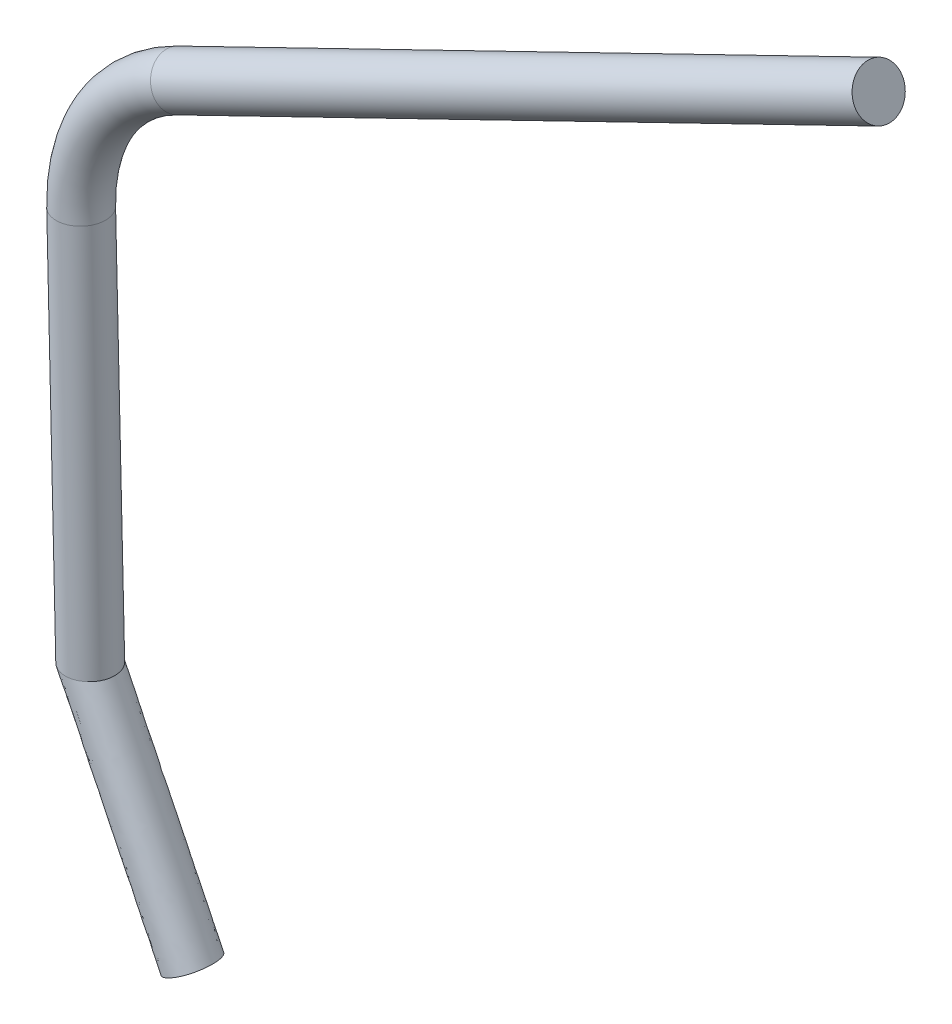
ISO-10303-21;
HEADER;
FILE_DESCRIPTION(('STEP AP214'),'2;1');
FILE_NAME('part.step','',(''),(''),'','','');
FILE_SCHEMA(('AUTOMOTIVE_DESIGN { 1 0 10303 214 1 1 1 1 }'));
ENDSEC;
DATA;
#1=APPLICATION_CONTEXT('core data for automotive mechanical design processes');
#2=APPLICATION_PROTOCOL_DEFINITION('international standard','automotive_design',2000,#1);
#3=PRODUCT_CONTEXT('',#1,'mechanical');
#4=PRODUCT('Part','Part','',(#3));
#5=PRODUCT_RELATED_PRODUCT_CATEGORY('part','',(#4));
#6=PRODUCT_DEFINITION_FORMATION('','',#4);
#7=PRODUCT_DEFINITION_CONTEXT('part definition',#1,'design');
#8=PRODUCT_DEFINITION('design','',#6,#7);
#9=PRODUCT_DEFINITION_SHAPE('','',#8);
#10=(LENGTH_UNIT() NAMED_UNIT(*) SI_UNIT(.MILLI.,.METRE.));
#11=(NAMED_UNIT(*) PLANE_ANGLE_UNIT() SI_UNIT($,.RADIAN.));
#12=(NAMED_UNIT(*) SI_UNIT($,.STERADIAN.) SOLID_ANGLE_UNIT());
#13=UNCERTAINTY_MEASURE_WITH_UNIT(LENGTH_MEASURE(1.E-05),#10,'distance_accuracy_value','');
#14=(GEOMETRIC_REPRESENTATION_CONTEXT(3) GLOBAL_UNCERTAINTY_ASSIGNED_CONTEXT((#13)) GLOBAL_UNIT_ASSIGNED_CONTEXT((#10,
#11,#12)) REPRESENTATION_CONTEXT('',''));
#15=CARTESIAN_POINT('',(0.,0.,0.));
#16=DIRECTION('',(0.,0.,1.));
#17=DIRECTION('',(1.,0.,0.));
#18=AXIS2_PLACEMENT_3D('',#15,#16,#17);
#19=CARTESIAN_POINT('',(0.,0.,0.));
#20=DIRECTION('',(0.,0.,-1.));
#21=DIRECTION('',(-1.,0.,0.));
#22=AXIS2_PLACEMENT_3D('',#19,#20,#21);
#23=TOROIDAL_SURFACE('',#22,88.8758294599473,12.7);
#24=CARTESIAN_POINT('',(-38.8641021219348,79.9280590809602,0.));
#25=DIRECTION('',(0.899322791884384,0.437285394219013,0.));
#26=DIRECTION('',(0.,0.,1.));
#27=AXIS2_PLACEMENT_3D('',#24,#25,#26);
#28=CIRCLE('',#27,12.7);
#29=CARTESIAN_POINT('',(-38.8641021219348,79.9280590809602,12.7));
#30=VERTEX_POINT('',#29);
#31=EDGE_CURVE('E86',#30,#30,#28,.T.);
#32=ORIENTED_EDGE('',*,*,#31,.F.);
#33=EDGE_LOOP('',(#32));
#34=FACE_BOUND('',#33,.T.);
#35=CARTESIAN_POINT('',(-88.851665491492,-2.07234205227966,0.));
#36=DIRECTION('',(0.0233172738288038,-0.999728115409981,0.));
#37=DIRECTION('',(0.999728115409981,0.0233172738288038,0.));
#38=AXIS2_PLACEMENT_3D('',#35,#36,#37);
#39=CIRCLE('',#38,12.7);
#40=CARTESIAN_POINT('',(-76.1551184257853,-1.77621267465385,0.));
#41=VERTEX_POINT('',#40);
#42=EDGE_CURVE('E82',#41,#41,#39,.T.);
#43=ORIENTED_EDGE('',*,*,#42,.F.);
#44=EDGE_LOOP('',(#43));
#45=FACE_BOUND('',#44,.T.);
#46=CARTESIAN_POINT('',(-68.2785297565327,37.4552974767412,-6.34980000000002));
#47=CARTESIAN_POINT('',(-68.3611876244129,37.382223809573,-6.41445774121699));
#48=CARTESIAN_POINT('',(-68.4443483690339,37.3107161993584,-6.48021370807255));
#49=CARTESIAN_POINT('',(-68.6117186874237,37.1706861630903,-6.61351606039512));
#50=CARTESIAN_POINT('',(-68.6959281257715,37.1021633566365,-6.68106221593499));
#51=CARTESIAN_POINT('',(-68.9501459405805,36.9008877669146,-6.88573794059409));
#52=CARTESIAN_POINT('',(-69.1218217285547,36.7723591420587,-7.02496654285916));
#53=CARTESIAN_POINT('',(-69.4701443978759,36.5256206836409,-7.3067283433511));
#54=CARTESIAN_POINT('',(-69.6467961121818,36.4074213740786,-7.44926472887694));
#55=CARTESIAN_POINT('',(-70.0052925566176,36.1809426296689,-7.73573144752601));
#56=CARTESIAN_POINT('',(-70.1871379358452,36.0726644419297,-7.87966195338593));
#57=CARTESIAN_POINT('',(-70.5585429060159,35.8645314563947,-8.1691977338584));
#58=CARTESIAN_POINT('',(-70.7481691642829,35.7647942659621,-8.31480222789594));
#59=CARTESIAN_POINT('',(-71.1332560641007,35.5752027925097,-8.60466404939599));
#60=CARTESIAN_POINT('',(-71.3287166128607,35.4853483524172,-8.74892139823618));
#61=CARTESIAN_POINT('',(-71.9239698668014,35.2308656546435,-9.17782825917873));
#62=CARTESIAN_POINT('',(-72.3329777738266,35.0811247184879,-9.45888538305785));
#63=CARTESIAN_POINT('',(-73.0324228439706,34.8680810695907,-9.91028270319883));
#64=CARTESIAN_POINT('',(-73.3159211557014,34.7926966771,-10.0857907650338));
#65=CARTESIAN_POINT('',(-73.8935620655111,34.6618652041449,-10.4265341688002));
#66=CARTESIAN_POINT('',(-74.1877037793146,34.6064164715521,-10.5917703610534));
#67=CARTESIAN_POINT('',(-74.7847851582528,34.5171980425895,-10.9087875560176));
#68=CARTESIAN_POINT('',(-75.0876828684849,34.4833386210953,-11.0606219573564));
#69=CARTESIAN_POINT('',(-75.7023587330905,34.438654632966,-11.3489918503462));
#70=CARTESIAN_POINT('',(-76.0141350381799,34.4278253045428,-11.4855304990722));
#71=CARTESIAN_POINT('',(-76.5817506444538,34.430627926228,-11.7150845210898));
#72=CARTESIAN_POINT('',(-76.8363046895836,34.4398003241575,-11.8113427446681));
#73=CARTESIAN_POINT('',(-77.3487813644931,34.4748280943983,-11.9909438221812));
#74=CARTESIAN_POINT('',(-77.6067032357763,34.5006797716239,-12.0742895316516));
#75=CARTESIAN_POINT('',(-78.1244953314751,34.5697693032544,-12.2267574836909));
#76=CARTESIAN_POINT('',(-78.3843658889851,34.6130101997432,-12.2958772343589));
#77=CARTESIAN_POINT('',(-78.9042044750144,34.7173562301637,-12.4186635047221));
#78=CARTESIAN_POINT('',(-79.164172504587,34.7784615630576,-12.4723298522942));
#79=CARTESIAN_POINT('',(-79.6836238758807,34.9191131531688,-12.5634681680949));
#80=CARTESIAN_POINT('',(-79.9430958641223,34.9987632789432,-12.6008453831023));
#81=CARTESIAN_POINT('',(-80.4577735483932,35.1761111705754,-12.6582402521289));
#82=CARTESIAN_POINT('',(-80.7129792295023,35.2738089995356,-12.6782578454502));
#83=CARTESIAN_POINT('',(-81.2167504163944,35.4866221386738,-12.7005883706939));
#84=CARTESIAN_POINT('',(-81.4653174626995,35.6017333659499,-12.7029054462975));
#85=CARTESIAN_POINT('',(-81.9536589867046,35.8483999288208,-12.6899026260559));
#86=CARTESIAN_POINT('',(-82.1934339981349,35.9799542640736,-12.674583802653));
#87=CARTESIAN_POINT('',(-82.6401833207013,36.2451086232329,-12.6290097663058));
#88=CARTESIAN_POINT('',(-82.8481227554667,36.3773550509284,-12.6002931907044));
#89=CARTESIAN_POINT('',(-83.2540210427322,36.6531805061838,-12.5293102489984));
#90=CARTESIAN_POINT('',(-83.4519765719696,36.7967632669088,-12.4870394051943));
#91=CARTESIAN_POINT('',(-83.8368162873283,37.0939718711076,-12.3896983544277));
#92=CARTESIAN_POINT('',(-84.0237023242137,37.247596026624,-12.3346302947192));
#93=CARTESIAN_POINT('',(-84.3857438442941,37.5636753106242,-12.2125448028781));
#94=CARTESIAN_POINT('',(-84.5608978446694,37.7261315507176,-12.1455258641717));
#95=CARTESIAN_POINT('',(-84.9094172216193,38.0689080681905,-11.9959827061691));
#96=CARTESIAN_POINT('',(-85.0820058672186,38.2497121426851,-11.9127570744036));
#97=CARTESIAN_POINT('',(-85.413073052434,38.6184571973195,-11.7350304796194));
#98=CARTESIAN_POINT('',(-85.5715513443383,38.8063983026695,-11.6405293187233));
#99=CARTESIAN_POINT('',(-86.0257883918963,39.379188181734,-11.3416725112759));
#100=CARTESIAN_POINT('',(-86.3004127360984,39.7730666837944,-11.1219356078071));
#101=CARTESIAN_POINT('',(-86.7339424539597,40.4779757021258,-10.7073632035783));
#102=CARTESIAN_POINT('',(-86.9047620413378,40.7859466821459,-10.5194016953883));
#103=CARTESIAN_POINT('',(-87.2156593836741,41.4074890645984,-10.1278497309483));
#104=CARTESIAN_POINT('',(-87.3557342266351,41.7210609944874,-9.92425779672097));
#105=CARTESIAN_POINT('',(-87.6066785134096,42.3521192934771,-9.50361344359423));
#106=CARTESIAN_POINT('',(-87.7174663088841,42.6696140759,-9.28652543517269));
#107=CARTESIAN_POINT('',(-87.9106671042042,43.3056694140145,-8.84176561701304));
#108=CARTESIAN_POINT('',(-87.9930869296525,43.6242296946849,-8.61409636820656));
#109=CARTESIAN_POINT('',(-88.1104486946373,44.1665898935884,-8.21892903824646));
#110=CARTESIAN_POINT('',(-88.1522226049346,44.390514592692,-8.05357834271191));
#111=CARTESIAN_POINT('',(-88.2227713179023,44.8377125614741,-7.71930250161433));
#112=CARTESIAN_POINT('',(-88.2515474879727,45.0609858972214,-7.55037773401234));
#113=CARTESIAN_POINT('',(-88.2963207323762,45.5049747333173,-7.21077024634431));
#114=CARTESIAN_POINT('',(-88.3124057723668,45.7256972016901,-7.04010808328857));
#115=CARTESIAN_POINT('',(-88.3324302096193,46.1659016286884,-6.69650767073097));
#116=CARTESIAN_POINT('',(-88.336370292617,46.3853836566539,-6.52356955028935));
#117=CARTESIAN_POINT('',(-88.3343889833309,46.6041306373585,-6.3498));
#118=B_SPLINE_CURVE_WITH_KNOTS('',3,(#46,#47,#48,#49,#50,#51,#52,#53,#54,#55,#56,#57,#58,#59,
#60,#61,#62,#63,#64,#65,#66,#67,#68,#69,#70,#71,#72,#73,#74,#75,#76,#77,#78,#79,#80,#81,#82,#83,
#84,#85,#86,#87,#88,#89,#90,#91,#92,#93,#94,#95,#96,#97,#98,#99,#100,#101,#102,#103,#104,#105,
#106,#107,#108,#109,#110,#111,#112,#113,#114,#115,#116,#117),.UNSPECIFIED.,.F.,.F.,(4,2,2,2,2,2,
2,2,2,2,2,2,2,2,2,2,2,2,2,2,2,2,2,2,2,2,2,2,2,2,2,2,2,2,2,4),(0.,0.383594238035366,
0.767139444736189,1.53386782138117,2.30136848503539,3.06896549333994,3.84583870061765,
4.6226995587766,6.17498795452379,7.19977481699324,8.22447673270026,9.24489174409625,
10.2650957501453,11.0812351539779,11.8971938143865,12.7132952813926,13.5294058379432,
14.3502022918438,15.1710016156504,15.9916087849127,16.8121660555467,17.5556250440723,
18.2993298903325,19.0429100397987,19.7865839941884,20.5761293110602,21.3656884859214,
22.9445280738512,24.1406792992436,25.3369437695963,26.5365089084683,27.7357852184842,
28.5799057122152,29.423937381327,30.262066146771,31.1001475884131),.UNSPECIFIED.);
#119=CARTESIAN_POINT('',(-68.2787854715161,37.4550714045806,-6.35));
#120=VERTEX_POINT('',#119);
#121=CARTESIAN_POINT('',(-88.3343912742981,46.6038788428488,-6.35));
#122=VERTEX_POINT('',#121);
#123=EDGE_CURVE('E62',#120,#122,#118,.T.);
#124=ORIENTED_EDGE('',*,*,#123,.F.);
#125=CARTESIAN_POINT('',(0.,0.,-6.35));
#126=DIRECTION('',(0.,0.,1.));
#127=DIRECTION('',(1.,0.,0.));
#128=AXIS2_PLACEMENT_3D('',#125,#126,#127);
#129=CIRCLE('',#128,77.8773068318849);
#130=CARTESIAN_POINT('',(-64.5741252389737,43.5322555010522,-6.34999999999993));
#131=VERTEX_POINT('',#130);
#132=EDGE_CURVE('E72',#120,#131,#129,.F.);
#133=ORIENTED_EDGE('',*,*,#132,.T.);
#134=CARTESIAN_POINT('',(-81.8947582558495,57.1678042235169,-6.34980000000003));
#135=CARTESIAN_POINT('',(-81.7182928434288,57.2607907419098,-6.50824253962551));
#136=CARTESIAN_POINT('',(-81.5390322799268,57.3496764295566,-6.66599417179145));
#137=CARTESIAN_POINT('',(-81.1749478955322,57.5189796942611,-6.97966519120021));
#138=CARTESIAN_POINT('',(-80.9901233034578,57.5993960904509,-7.13558432025285));
#139=CARTESIAN_POINT('',(-80.6145333974545,57.7516521851863,-7.44546983223571));
#140=CARTESIAN_POINT('',(-80.4237547956423,57.8234706682895,-7.59943057975211));
#141=CARTESIAN_POINT('',(-80.0368112639317,57.9579378741337,-7.90452389220079));
#142=CARTESIAN_POINT('',(-79.8406464658417,58.0205868210302,-8.0556565261894));
#143=CARTESIAN_POINT('',(-79.2399509400218,58.1954393895427,-8.50733329870514));
#144=CARTESIAN_POINT('',(-78.8271900644294,58.2929218431795,-8.80286213795732));
#145=CARTESIAN_POINT('',(-77.9821416717232,58.444818369245,-9.37579262994487));
#146=CARTESIAN_POINT('',(-77.5498765845066,58.4992806445849,-9.65321425053158));
#147=CARTESIAN_POINT('',(-76.8259021435821,58.5497586459483,-10.0898967830973));
#148=CARTESIAN_POINT('',(-76.5392054022991,58.5597101420604,-10.2559367412402));
#149=CARTESIAN_POINT('',(-75.9595790389722,58.5587253707307,-10.5769957564925));
#150=CARTESIAN_POINT('',(-75.6666479751086,58.5477842183506,-10.7320122273954));
#151=CARTESIAN_POINT('',(-75.0770288614208,58.5037473995615,-11.0286217394179));
#152=CARTESIAN_POINT('',(-74.7803587854975,58.4707340903063,-11.1702624551474));
#153=CARTESIAN_POINT('',(-74.1839825170037,58.3813727132922,-11.4387352309101));
#154=CARTESIAN_POINT('',(-73.8842782299402,58.325038499938,-11.5655760259781));
#155=CARTESIAN_POINT('',(-73.3344268060043,58.1994842236298,-11.7824274716115));
#156=CARTESIAN_POINT('',(-73.0844426328759,58.13403739867,-11.8750422380277));
#157=CARTESIAN_POINT('',(-72.585263194274,57.9857751996351,-12.0473152890887));
#158=CARTESIAN_POINT('',(-72.3360676057422,57.9029682404918,-12.1269798179726));
#159=CARTESIAN_POINT('',(-71.8399389804209,57.7196402784622,-12.272158660153));
#160=CARTESIAN_POINT('',(-71.5930068117503,57.6191127553723,-12.3376677452));
#161=CARTESIAN_POINT('',(-71.1033857263883,57.4003503699659,-12.4532993034579));
#162=CARTESIAN_POINT('',(-70.8606968472167,57.2821153511649,-12.5034216406813));
#163=CARTESIAN_POINT('',(-70.3802181827165,57.02753168171,-12.5874767900738));
#164=CARTESIAN_POINT('',(-70.1424653525509,56.8910811341332,-12.6213131997939));
#165=CARTESIAN_POINT('',(-69.6755044280417,56.6013515165949,-12.6715435339542));
#166=CARTESIAN_POINT('',(-69.446296340864,56.448072432521,-12.6879374437672));
#167=CARTESIAN_POINT('',(-68.9986432988342,56.1259130585365,-12.702804327377));
#168=CARTESIAN_POINT('',(-68.7801940596821,55.957039056998,-12.7012844935351));
#169=CARTESIAN_POINT('',(-68.3559143139219,55.6051716601053,-12.6802609708662));
#170=CARTESIAN_POINT('',(-68.1500829662145,55.4221792077173,-12.6607584821429));
#171=CARTESIAN_POINT('',(-67.772434801102,55.0626983508832,-12.6069298343118));
#172=CARTESIAN_POINT('',(-67.5992702671597,54.8873699156585,-12.5742688630523));
#173=CARTESIAN_POINT('',(-67.2654415352278,54.5281786799638,-12.4951581365015));
#174=CARTESIAN_POINT('',(-67.1047760673419,54.3443167495293,-12.4487097843137));
#175=CARTESIAN_POINT('',(-66.7965781711854,53.9694928346266,-12.3427433784491));
#176=CARTESIAN_POINT('',(-66.6490465318326,53.7785304246251,-12.2832245404032));
#177=CARTESIAN_POINT('',(-66.3674853538482,53.3909033050828,-12.1519991911047));
#178=CARTESIAN_POINT('',(-66.2334585157661,53.1942374651153,-12.0802902498757));
#179=CARTESIAN_POINT('',(-65.9421429214791,52.7388012648069,-11.9032275977684));
#180=CARTESIAN_POINT('',(-65.7893884228289,52.4785683545412,-11.7941488751592));
#181=CARTESIAN_POINT('',(-65.5064307084628,51.9532874000393,-11.5595967918273));
#182=CARTESIAN_POINT('',(-65.3762330608014,51.6882381847094,-11.4341193965397));
#183=CARTESIAN_POINT('',(-65.1376009358636,51.154908590536,-11.1688240257406));
#184=CARTESIAN_POINT('',(-65.0292051414965,50.8866233482991,-11.0289812142297));
#185=CARTESIAN_POINT('',(-64.8336136234323,50.3488085659065,-10.7373309328441));
#186=CARTESIAN_POINT('',(-64.7464236363158,50.0792787091074,-10.5855202401004));
#187=CARTESIAN_POINT('',(-64.5633027974285,49.438566644233,-10.2129784457458));
#188=CARTESIAN_POINT('',(-64.4764543969992,49.0673437338691,-9.98782949662332));
#189=CARTESIAN_POINT('',(-64.3388850157084,48.3265626956703,-9.52403531159774));
#190=CARTESIAN_POINT('',(-64.2881820360222,47.9570054882978,-9.28538341471303));
#191=CARTESIAN_POINT('',(-64.2210803651996,47.220339626918,-8.79983091100365));
#192=CARTESIAN_POINT('',(-64.2046787506558,46.8532307669035,-8.55293100895525));
#193=CARTESIAN_POINT('',(-64.205104421507,46.121024341116,-8.0564802229994));
#194=CARTESIAN_POINT('',(-64.2219171388662,45.7559259639627,-7.80693054904934));
#195=CARTESIAN_POINT('',(-64.2696353671895,45.2364059995455,-7.45491791172901));
#196=CARTESIAN_POINT('',(-64.2868264690041,45.0818841362893,-7.35060696909842));
#197=CARTESIAN_POINT('',(-64.327330432716,44.7726576725997,-7.14352574704636));
#198=CARTESIAN_POINT('',(-64.3506416272345,44.617953133346,-7.04075505604263));
#199=CARTESIAN_POINT('',(-64.4034829589577,44.3085540107711,-6.83787680969315));
#200=CARTESIAN_POINT('',(-64.4329934720897,44.1538609014504,-6.7377619476651));
#201=CARTESIAN_POINT('',(-64.4985921540352,43.8436068978195,-6.5409349740682));
#202=CARTESIAN_POINT('',(-64.5346834326534,43.6880456270862,-6.44422449716291));
#203=CARTESIAN_POINT('',(-64.5742090381367,43.5319246287586,-6.34980000000002));
#204=B_SPLINE_CURVE_WITH_KNOTS('',3,(#134,#135,#136,#137,#138,#139,#140,#141,#142,#143,#144,
#145,#146,#147,#148,#149,#150,#151,#152,#153,#154,#155,#156,#157,#158,#159,#160,#161,#162,#163,
#164,#165,#166,#167,#168,#169,#170,#171,#172,#173,#174,#175,#176,#177,#178,#179,#180,#181,#182,
#183,#184,#185,#186,#187,#188,#189,#190,#191,#192,#193,#194,#195,#196,#197,#198,#199,#200,#201,
#202,#203),.UNSPECIFIED.,.F.,.F.,(4,2,2,2,2,2,2,2,2,2,2,2,2,2,2,2,2,2,2,2,2,2,2,2,2,2,2,2,2,2,2,
2,2,2,4),(0.,0.764172452597086,1.52845131261392,2.29457877986253,3.06068751548278,
4.60907791416076,6.15573091378126,7.14931683965479,8.1431351056373,9.1332657108872,
10.1228089448623,10.9455359964427,11.7678651679987,12.5904975459417,13.4131371940712,
14.2405882257232,15.0680399512773,15.8951594665943,16.7222237866501,17.4671211068632,
18.2119426469191,18.956808896474,19.7018238022447,20.6630100125315,21.6244331501851,
22.5875473727575,23.5509218472618,24.8772438710529,26.2042259703661,27.5310949701752,
28.8573821252636,29.4189788016366,29.9804226331846,30.5401152847676,31.1000731132822),.UNSPECIFIED.);
#205=CARTESIAN_POINT('',(-81.8945354898232,57.167921616111,-6.35));
#206=VERTEX_POINT('',#205);
#207=EDGE_CURVE('E73',#206,#131,#204,.T.);
#208=ORIENTED_EDGE('',*,*,#207,.F.);
#209=CARTESIAN_POINT('',(0.,0.,-6.35));
#210=DIRECTION('',(0.,0.,-1.));
#211=DIRECTION('',(-1.,0.,0.));
#212=AXIS2_PLACEMENT_3D('',#209,#210,#211);
#213=CIRCLE('',#212,99.8743520880097);
#214=EDGE_CURVE('E47',#206,#122,#213,.F.);
#215=ORIENTED_EDGE('',*,*,#214,.T.);
#216=EDGE_LOOP('',(#124,#133,#208,#215));
#217=FACE_BOUND('',#216,.T.);
#218=ADVANCED_FACE('F34',(#34,#45,#217),#23,.T.);
#219=CARTESIAN_POINT('',(326.620680499879,257.640843291567,0.));
#220=DIRECTION('',(-0.899322791884384,-0.437285394219013,0.));
#221=DIRECTION('',(0.437285394219013,-0.899322791884384,0.));
#222=AXIS2_PLACEMENT_3D('',#219,#220,#221);
#223=CYLINDRICAL_SURFACE('',#222,12.7);
#224=CARTESIAN_POINT('',(326.620680499879,257.640843291567,0.));
#225=DIRECTION('',(0.899322791884384,0.437285394219013,0.));
#226=DIRECTION('',(-0.437285394219013,0.899322791884384,0.));
#227=AXIS2_PLACEMENT_3D('',#224,#225,#226);
#228=CIRCLE('',#227,12.7);
#229=CARTESIAN_POINT('',(321.067155993297,269.062242748499,0.));
#230=VERTEX_POINT('',#229);
#231=EDGE_CURVE('E81',#230,#230,#228,.T.);
#232=ORIENTED_EDGE('',*,*,#231,.F.);
#233=EDGE_LOOP('',(#232));
#234=FACE_BOUND('',#233,.T.);
#235=ORIENTED_EDGE('',*,*,#31,.T.);
#236=EDGE_LOOP('',(#235));
#237=FACE_BOUND('',#236,.T.);
#238=ADVANCED_FACE('F117',(#234,#237),#223,.T.);
#239=CARTESIAN_POINT('',(326.620680499879,257.640843291567,0.));
#240=DIRECTION('',(0.899322791884384,0.437285394219013,0.));
#241=DIRECTION('',(-0.437285394219013,0.899322791884384,0.));
#242=AXIS2_PLACEMENT_3D('',#239,#240,#241);
#243=PLANE('',#242);
#244=ORIENTED_EDGE('',*,*,#231,.T.);
#245=EDGE_LOOP('',(#244));
#246=FACE_BOUND('',#245,.T.);
#247=ADVANCED_FACE('F114',(#246),#243,.T.);
#248=CARTESIAN_POINT('',(-84.1135954494791,-205.217095103588,0.));
#249=DIRECTION('',(-0.0233172738288038,0.999728115409981,0.));
#250=DIRECTION('',(-0.999728115409981,-0.0233172738288038,0.));
#251=AXIS2_PLACEMENT_3D('',#248,#249,#250);
#252=CYLINDRICAL_SURFACE('',#251,12.7);
#253=CARTESIAN_POINT('',(-84.1135954494791,-205.217095103588,0.));
#254=DIRECTION('',(0.0233172738288038,-0.999728115409981,0.));
#255=DIRECTION('',(0.999728115409981,0.0233172738288038,0.));
#256=AXIS2_PLACEMENT_3D('',#253,#254,#255);
#257=CIRCLE('',#256,12.7);
#258=CARTESIAN_POINT('',(-71.4170483837723,-204.920965725962,0.));
#259=VERTEX_POINT('',#258);
#260=EDGE_CURVE('E79',#259,#259,#257,.T.);
#261=ORIENTED_EDGE('',*,*,#260,.F.);
#262=EDGE_LOOP('',(#261));
#263=FACE_BOUND('',#262,.T.);
#264=ORIENTED_EDGE('',*,*,#42,.T.);
#265=EDGE_LOOP('',(#264));
#266=FACE_BOUND('',#265,.T.);
#267=ADVANCED_FACE('F110',(#263,#266),#252,.T.);
#268=CARTESIAN_POINT('',(-76.2698894916076,46.4942351678984,-6.35));
#269=DIRECTION('',(0.,0.,-1.));
#270=DIRECTION('',(-1.,0.,0.));
#271=AXIS2_PLACEMENT_3D('',#268,#269,#270);
#272=CYLINDRICAL_SURFACE('',#271,12.065);
#273=CARTESIAN_POINT('',(-76.2698894916076,46.4942351678984,-6.35));
#274=DIRECTION('',(0.,0.,-1.));
#275=DIRECTION('',(-1.,0.,0.));
#276=AXIS2_PLACEMENT_3D('',#273,#274,#275);
#277=CIRCLE('',#276,12.065);
#278=EDGE_CURVE('E71',#120,#122,#277,.T.);
#279=ORIENTED_EDGE('',*,*,#278,.F.);
#280=ORIENTED_EDGE('',*,*,#123,.T.);
#281=EDGE_LOOP('',(#279,#280));
#282=FACE_BOUND('',#281,.T.);
#283=ADVANCED_FACE('F70',(#282),#272,.F.);
#284=EDGE_CURVE('E54',#206,#131,#277,.T.);
#285=ORIENTED_EDGE('',*,*,#284,.F.);
#286=ORIENTED_EDGE('',*,*,#207,.T.);
#287=EDGE_LOOP('',(#285,#286));
#288=FACE_BOUND('',#287,.T.);
#289=ADVANCED_FACE('F104',(#288),#272,.F.);
#290=CARTESIAN_POINT('',(-76.2698894916076,46.4942351678984,-6.35));
#291=DIRECTION('',(0.,0.,-1.));
#292=DIRECTION('',(-1.,0.,0.));
#293=AXIS2_PLACEMENT_3D('',#290,#291,#292);
#294=PLANE('',#293);
#295=ORIENTED_EDGE('',*,*,#284,.T.);
#296=ORIENTED_EDGE('',*,*,#132,.F.);
#297=ORIENTED_EDGE('',*,*,#278,.T.);
#298=ORIENTED_EDGE('',*,*,#214,.F.);
#299=EDGE_LOOP('',(#295,#296,#297,#298));
#300=FACE_BOUND('',#299,.T.);
#301=ADVANCED_FACE('F75',(#300),#294,.T.);
#302=CARTESIAN_POINT('',(-71.4170483837723,-204.920965725962,0.));
#303=CARTESIAN_POINT('',(-15.8818033179577,-319.134960295279,0.));
#304=CARTESIAN_POINT('',(-71.4170483837723,-204.920965725962,25.4));
#305=CARTESIAN_POINT('',(-15.8818033179577,-319.134960295279,25.4));
#306=CARTESIAN_POINT('',(-96.8101425151859,-205.513224481214,25.4));
#307=CARTESIAN_POINT('',(-41.2748974493712,-319.72721905053,25.4));
#308=CARTESIAN_POINT('',(-96.8101425151859,-205.513224481214,0.));
#309=CARTESIAN_POINT('',(-41.2748974493712,-319.72721905053,0.));
#310=CARTESIAN_POINT('',(-96.8101425151859,-205.513224481214,-25.4));
#311=CARTESIAN_POINT('',(-41.2748974493712,-319.72721905053,-25.4));
#312=CARTESIAN_POINT('',(-71.4170483837723,-204.920965725962,-25.4));
#313=CARTESIAN_POINT('',(-15.8818033179577,-319.134960295279,-25.4));
#314=CARTESIAN_POINT('',(-71.4170483837723,-204.920965725962,0.));
#315=CARTESIAN_POINT('',(-15.8818033179577,-319.134960295279,0.));
#316=(BOUNDED_SURFACE() B_SPLINE_SURFACE(3,1,((#302,#303),(#304,#305),(#306,#307),(#308,#309),
(#310,#311),(#312,#313),(#314,#315)),.UNSPECIFIED.,.T.,.F.,.F.) B_SPLINE_SURFACE_WITH_KNOTS((4,
3,4),(2,2),(0.,0.5,1.),(0.,1.),
.UNSPECIFIED.) GEOMETRIC_REPRESENTATION_ITEM() RATIONAL_B_SPLINE_SURFACE(((1.,1.),
(0.333333333333333,0.333333333333333),(0.333333333333333,0.333333333333333),(1.,1.),
(0.333333333333333,0.333333333333333),(0.333333333333333,0.333333333333333),(1.,1.))) REPRESENTATION_ITEM('') SURFACE());
#317=CARTESIAN_POINT('',(-20.5045209888939,-309.627861689014,0.));
#318=CARTESIAN_POINT('',(-20.5045204251192,-309.627861414885,0.385772176738716));
#319=CARTESIAN_POINT('',(-20.5188962786039,-309.634851508781,0.771521162680156));
#320=CARTESIAN_POINT('',(-20.5763703388341,-309.662797611462,1.54049588212366));
#321=CARTESIAN_POINT('',(-20.6194770619748,-309.683757761246,1.92372083342735));
#322=CARTESIAN_POINT('',(-20.7343726038837,-309.73962440089,2.68526164187033));
#323=CARTESIAN_POINT('',(-20.8061933640123,-309.77454642187,3.06357154602823));
#324=CARTESIAN_POINT('',(-20.9783524151044,-309.858256786162,3.81227798923772));
#325=CARTESIAN_POINT('',(-21.0787036772066,-309.907051436542,4.18267084633215));
#326=CARTESIAN_POINT('',(-21.3078051703053,-310.018449410251,4.91320554888954));
#327=CARTESIAN_POINT('',(-21.4366066738812,-310.081077664283,5.27332754419128));
#328=CARTESIAN_POINT('',(-21.7219776456472,-310.219836026701,5.97950910768474));
#329=CARTESIAN_POINT('',(-21.8785333357016,-310.295959435627,6.32557554924336));
#330=CARTESIAN_POINT('',(-22.2187946115723,-310.46140757894,7.00074349498677));
#331=CARTESIAN_POINT('',(-22.4024957738324,-310.550730162424,7.32984775152199));
#332=CARTESIAN_POINT('',(-22.7962041674439,-310.742166353813,7.96799886130273));
#333=CARTESIAN_POINT('',(-23.0062095419429,-310.844279058845,8.27704712799406));
#334=CARTESIAN_POINT('',(-23.4392621897422,-311.054845942637,8.8556681880782));
#335=CARTESIAN_POINT('',(-23.6609766953365,-311.162652078385,9.12647415584));
#336=CARTESIAN_POINT('',(-24.1256571532597,-311.388597622146,9.64449453395374));
#337=CARTESIAN_POINT('',(-24.3686202886869,-311.506735660473,9.89171206233419));
#338=CARTESIAN_POINT('',(-24.8741713799435,-311.752554080992,10.3597302007582));
#339=CARTESIAN_POINT('',(-25.1367510085792,-311.880230414182,10.5805419176918));
#340=CARTESIAN_POINT('',(-25.6797337733377,-312.144249556679,10.9931726500152));
#341=CARTESIAN_POINT('',(-25.960135059318,-312.280591466376,11.1849946679886));
#342=CARTESIAN_POINT('',(-26.5092214675164,-312.5475784355,11.5204640580001));
#343=CARTESIAN_POINT('',(-26.776505085477,-312.677542029554,11.6669522485444));
#344=CARTESIAN_POINT('',(-27.3219077915059,-312.942737840743,11.9324182754372));
#345=CARTESIAN_POINT('',(-27.6000261907864,-313.077969722962,12.0513978572366));
#346=CARTESIAN_POINT('',(-28.1648009791935,-313.35258498705,12.2603439242459));
#347=CARTESIAN_POINT('',(-28.4514531819945,-313.491966333365,12.3503243871317));
#348=CARTESIAN_POINT('',(-29.0310506158595,-313.773788938823,12.500195996868));
#349=CARTESIAN_POINT('',(-29.3239954675826,-313.916230013514,12.5600889522108));
#350=CARTESIAN_POINT('',(-29.8898685114864,-314.191379291742,12.6454172294231));
#351=CARTESIAN_POINT('',(-30.1625074884501,-314.323946867697,12.6732402786809));
#352=CARTESIAN_POINT('',(-30.7089192612755,-314.589633326043,12.7024776142314));
#353=CARTESIAN_POINT('',(-30.9826919837407,-314.722752172747,12.7038935841376));
#354=CARTESIAN_POINT('',(-31.5292599314062,-314.988514569318,12.6803046708576));
#355=CARTESIAN_POINT('',(-31.8020553314184,-315.121158204186,12.6553047764595));
#356=CARTESIAN_POINT('',(-32.3446800396983,-315.385003245827,12.579177260026));
#357=CARTESIAN_POINT('',(-32.6145093489918,-315.516204653098,12.5280496470277));
#358=CARTESIAN_POINT('',(-33.1419093628968,-315.772646861694,12.4019900711706));
#359=CARTESIAN_POINT('',(-33.3996135691676,-315.89795257667,12.3277466849381));
#360=CARTESIAN_POINT('',(-33.9086160129675,-316.145449177784,12.1558547359554));
#361=CARTESIAN_POINT('',(-34.15991442615,-316.267640149331,12.0582068157469));
#362=CARTESIAN_POINT('',(-34.6545248603094,-316.508138800803,11.8404699273004));
#363=CARTESIAN_POINT('',(-34.8978365175348,-316.626446303858,11.7203799386157));
#364=CARTESIAN_POINT('',(-35.3750150220117,-316.858468879429,11.4588981317907));
#365=CARTESIAN_POINT('',(-35.6088815815482,-316.972183812048,11.3175056653575));
#366=CARTESIAN_POINT('',(-36.0734185285056,-317.198059575247,11.0096845029059));
#367=CARTESIAN_POINT('',(-36.3037283569346,-317.310045088153,10.8425832468062));
#368=CARTESIAN_POINT('',(-36.7516277704972,-317.527831041537,10.4885063766618));
#369=CARTESIAN_POINT('',(-36.9692171718016,-317.63363139263,10.3015304755089));
#370=CARTESIAN_POINT('',(-37.3906385351474,-317.838542697743,9.9092416042731));
#371=CARTESIAN_POINT('',(-37.5944681317489,-317.937652501595,9.70392549535899));
#372=CARTESIAN_POINT('',(-37.987435553415,-318.128728403873,9.27657647122568));
#373=CARTESIAN_POINT('',(-38.1765720816192,-318.220693871715,9.05454208379255));
#374=CARTESIAN_POINT('',(-38.5531476558131,-318.40379942614,8.57795817342087));
#375=CARTESIAN_POINT('',(-38.7393704035285,-318.494348101634,8.32221976771044));
#376=CARTESIAN_POINT('',(-39.0931541468321,-318.666371389663,7.79526102938013));
#377=CARTESIAN_POINT('',(-39.2607143384825,-318.747845611291,7.52404003056814));
#378=CARTESIAN_POINT('',(-39.5765805800194,-318.901431948919,6.96803989790044));
#379=CARTESIAN_POINT('',(-39.7248843613493,-318.973542961859,6.68325917199361));
#380=CARTESIAN_POINT('',(-40.0017850479501,-319.108182745252,6.10197857470382));
#381=CARTESIAN_POINT('',(-40.1303749163321,-319.170708094098,5.80547456597553));
#382=CARTESIAN_POINT('',(-40.3780217363013,-319.291123520322,5.17572598393395));
#383=CARTESIAN_POINT('',(-40.4951992473673,-319.348099741299,4.84156630141116));
#384=CARTESIAN_POINT('',(-40.7053485263038,-319.450282418213,4.16381773333313));
#385=CARTESIAN_POINT('',(-40.798309430019,-319.495483591579,3.82022469188993));
#386=CARTESIAN_POINT('',(-40.9597179615958,-319.573966639043,3.12596414895632));
#387=CARTESIAN_POINT('',(-41.0281633849943,-319.607247441246,2.77529601425797));
#388=CARTESIAN_POINT('',(-41.1403624333815,-319.661802941838,2.06910517270404));
#389=CARTESIAN_POINT('',(-41.1841149380225,-319.683077095471,1.71358224633008));
#390=CARTESIAN_POINT('',(-41.2490241545134,-319.714638457618,0.974781733817003));
#391=CARTESIAN_POINT('',(-41.2683798522176,-319.724049943658,0.591307166168135));
#392=CARTESIAN_POINT('',(-41.2786399287133,-319.729038788192,-0.176111572041603));
#393=CARTESIAN_POINT('',(-41.2695437976787,-319.72461589879,-0.560055750894168));
#394=CARTESIAN_POINT('',(-41.2229169746321,-319.701944140795,-1.32590747074568));
#395=CARTESIAN_POINT('',(-41.1853790163177,-319.683691739046,-1.70781446617316));
#396=CARTESIAN_POINT('',(-41.0819587287352,-319.633404810221,-2.46684716254693));
#397=CARTESIAN_POINT('',(-41.0160771572811,-319.601370651624,-2.84397299104823));
#398=CARTESIAN_POINT('',(-40.8545115674295,-319.522811236375,-3.59842999007326));
#399=CARTESIAN_POINT('',(-40.7582451035388,-319.476002772282,-3.97560734306458));
#400=CARTESIAN_POINT('',(-40.5367281833422,-319.368292710168,-4.7191416203774));
#401=CARTESIAN_POINT('',(-40.4114888603918,-319.307396525614,-5.08550264025125));
#402=CARTESIAN_POINT('',(-40.1324260130709,-319.171705416366,-5.80460064470122));
#403=CARTESIAN_POINT('',(-39.9785977615132,-319.096908193132,-6.1573353644974));
#404=CARTESIAN_POINT('',(-39.6429972253501,-318.933726281052,-6.84597620960713));
#405=CARTESIAN_POINT('',(-39.4612264887221,-318.845342344894,-7.18188326578551));
#406=CARTESIAN_POINT('',(-39.0790178483552,-318.659497776642,-7.81958359236814));
#407=CARTESIAN_POINT('',(-38.8797224504772,-318.562592674921,-8.12222322644938));
#408=CARTESIAN_POINT('',(-38.4573231293579,-318.357205849056,-8.70620421566486));
#409=CARTESIAN_POINT('',(-38.2342215384683,-318.24872525899,-8.98754765263221));
#410=CARTESIAN_POINT('',(-37.765564797238,-318.020846293071,-9.52588169511526));
#411=CARTESIAN_POINT('',(-37.5200190417529,-317.901452485358,-9.78288239930364));
#412=CARTESIAN_POINT('',(-37.0080037792817,-317.652490935716,-10.2696815602841));
#413=CARTESIAN_POINT('',(-36.7415363998971,-317.522924228309,-10.4994827771536));
#414=CARTESIAN_POINT('',(-36.2143001692334,-317.266561657436,-10.9098192250306));
#415=CARTESIAN_POINT('',(-35.955145048005,-317.140550451701,-11.0929209022585));
#416=CARTESIAN_POINT('',(-35.4229184804369,-316.881761386737,-11.4320889977498));
#417=CARTESIAN_POINT('',(-35.149848993541,-316.748984480264,-11.5881592090864));
#418=CARTESIAN_POINT('',(-34.5919692438713,-316.477721849691,-11.8713222179594));
#419=CARTESIAN_POINT('',(-34.3071648917183,-316.339238999562,-11.9984293979259));
#420=CARTESIAN_POINT('',(-33.7280209412593,-316.05763689521,-12.2221240159405));
#421=CARTESIAN_POINT('',(-33.4336820853221,-315.914518001956,-12.3187138238441));
#422=CARTESIAN_POINT('',(-32.8648128146399,-315.637911842817,-12.4728266890303));
#423=CARTESIAN_POINT('',(-32.5908782010707,-315.504714278421,-12.5330797187761));
#424=CARTESIAN_POINT('',(-32.0393087788302,-315.236519972194,-12.6265400141577));
#425=CARTESIAN_POINT('',(-31.7616742264347,-315.101523354974,-12.6597491431923));
#426=CARTESIAN_POINT('',(-31.204927944903,-314.830811860284,-12.6987262047741));
#427=CARTESIAN_POINT('',(-30.9258166357074,-314.695097187006,-12.7045015585725));
#428=CARTESIAN_POINT('',(-30.3682300268844,-314.423977092807,-12.6885622140071));
#429=CARTESIAN_POINT('',(-30.0897547186696,-314.288571667712,-12.6668478890366));
#430=CARTESIAN_POINT('',(-29.5480657020714,-314.025181595421,-12.5977781746041));
#431=CARTESIAN_POINT('',(-29.2847280082539,-313.89713666173,-12.5516174243236));
#432=CARTESIAN_POINT('',(-28.7624651963017,-313.643192358671,-12.4349548755865));
#433=CARTESIAN_POINT('',(-28.5035398669179,-313.517292886585,-12.3644542458961));
#434=CARTESIAN_POINT('',(-27.9918433499479,-313.268486323288,-12.1998459594616));
#435=CARTESIAN_POINT('',(-27.7390720735849,-313.145579188909,-12.105738643483));
#436=CARTESIAN_POINT('',(-27.2412931711247,-312.903539906062,-11.8948564433073));
#437=CARTESIAN_POINT('',(-26.9962859066502,-312.784407933427,-11.7780805050789));
#438=CARTESIAN_POINT('',(-26.511503495121,-312.548688045253,-11.520845793301));
#439=CARTESIAN_POINT('',(-26.271884479578,-312.432176046869,-11.3800234577));
#440=CARTESIAN_POINT('',(-25.8036473967116,-312.204501135017,-11.0774502682387));
#441=CARTESIAN_POINT('',(-25.5750276329528,-312.093337396676,-10.915702656011));
#442=CARTESIAN_POINT('',(-25.1299979160554,-311.876946800386,-10.5727101159637));
#443=CARTESIAN_POINT('',(-24.9135863420186,-311.771719154295,-10.3914677858171));
#444=CARTESIAN_POINT('',(-24.4938518949211,-311.567628092862,-10.0108366111259));
#445=CARTESIAN_POINT('',(-24.290538115684,-311.468769099288,-9.81143538580576));
#446=CARTESIAN_POINT('',(-23.8851972225676,-311.271676738415,-9.38251758610569));
#447=CARTESIAN_POINT('',(-23.6841257528813,-311.173908042145,-9.15188406634653));
#448=CARTESIAN_POINT('',(-23.2988617682868,-310.986577847801,-8.67364462861471));
#449=CARTESIAN_POINT('',(-23.1146766398662,-310.897019941321,-8.426031365297));
#450=CARTESIAN_POINT('',(-22.7639602480586,-310.726488117782,-7.91570041642537));
#451=CARTESIAN_POINT('',(-22.5974341284197,-310.645516701811,-7.65297836413776));
#452=CARTESIAN_POINT('',(-22.2826760788261,-310.492469209806,-7.11430994845125));
#453=CARTESIAN_POINT('',(-22.1344455620331,-310.420393820907,-6.83836256580361));
#454=CARTESIAN_POINT('',(-21.8442346841537,-310.279282109645,-6.24963874148091));
#455=CARTESIAN_POINT('',(-21.7040210768248,-310.211104851035,-5.93578425395198));
#456=CARTESIAN_POINT('',(-21.446481931289,-310.085879394949,-5.29703173869502));
#457=CARTESIAN_POINT('',(-21.3291361021859,-310.028821331257,-4.97214380450636));
#458=CARTESIAN_POINT('',(-21.1175561535966,-309.925943007631,-4.31334908576456));
#459=CARTESIAN_POINT('',(-21.0233124366346,-309.880118081035,-3.97944611061385));
#460=CARTESIAN_POINT('',(-20.8581210853372,-309.799795680862,-3.30461212367881));
#461=CARTESIAN_POINT('',(-20.7871738052239,-309.765298379523,-2.96368100511544));
#462=CARTESIAN_POINT('',(-20.6535708010131,-309.70033545087,-2.18879952393539));
#463=CARTESIAN_POINT('',(-20.5976908253632,-309.673164453536,-1.7533859109766));
#464=CARTESIAN_POINT('',(-20.5231654271715,-309.636927333314,-0.878638287760068));
#465=CARTESIAN_POINT('',(-20.5045216309011,-309.627862001182,-0.439304107115196));
#466=CARTESIAN_POINT('',(-20.5045209888939,-309.627861689014,0.));
#467=B_SPLINE_CURVE_WITH_KNOTS('',3,(#317,#318,#319,#320,#321,#322,#323,#324,#325,#326,#327,
#328,#329,#330,#331,#332,#333,#334,#335,#336,#337,#338,#339,#340,#341,#342,#343,#344,#345,#346,
#347,#348,#349,#350,#351,#352,#353,#354,#355,#356,#357,#358,#359,#360,#361,#362,#363,#364,#365,
#366,#367,#368,#369,#370,#371,#372,#373,#374,#375,#376,#377,#378,#379,#380,#381,#382,#383,#384,
#385,#386,#387,#388,#389,#390,#391,#392,#393,#394,#395,#396,#397,#398,#399,#400,#401,#402,#403,
#404,#405,#406,#407,#408,#409,#410,#411,#412,#413,#414,#415,#416,#417,#418,#419,#420,#421,#422,
#423,#424,#425,#426,#427,#428,#429,#430,#431,#432,#433,#434,#435,#436,#437,#438,#439,#440,#441,
#442,#443,#444,#445,#446,#447,#448,#449,#450,#451,#452,#453,#454,#455,#456,#457,#458,#459,#460,
#461,#462,#463,#464,#465,#466),.UNSPECIFIED.,.T.,.F.,(4,2,2,2,2,2,2,2,2,2,2,2,2,2,2,2,2,2,2,2,2,
2,2,2,2,2,2,2,2,2,2,2,2,2,2,2,2,2,2,2,2,2,2,2,2,2,2,2,2,2,2,2,2,2,2,2,2,2,2,2,2,2,2,2,2,2,2,2,2,
2,2,2,2,2,4),(0.,1.15694493303883,2.31423295992932,3.47281194655384,4.63191851543917,
5.79313130341194,6.95376923137873,8.11421823292479,9.27458536281843,10.3717701193705,
11.4688096434865,12.5653860923508,13.6618488862824,14.6545731076769,15.6472343223481,
16.639416352783,17.6315387382503,18.5437149255231,19.4558329557643,20.3677787580422,
21.2797242448976,22.1667526025918,23.0537566108399,23.9408009612126,24.8278723122338,
25.7442362776552,26.6606134826251,27.5771478223774,28.4937629668757,29.4798852620285,
30.4660500205335,31.4523308517948,32.4389629207721,33.5137835524568,34.5890855474685,
35.6644842107378,36.7399316622286,37.8908446655257,39.0417782920561,40.1930060576616,
41.3442030451778,42.5189648294523,43.6932759374947,44.8677813912373,46.0422218023296,
47.1660338505695,48.2897358970708,49.4129697109081,50.5360894463038,51.5589771539033,
52.581721212736,53.6039562862506,54.6261119576103,55.5564459331112,56.4867158006271,
57.4167340017321,58.3467395705031,59.2350020769658,60.1232219362597,61.0114289747228,
61.8996773223737,62.8027875459069,63.7057580315644,64.6086083450347,65.5120788995686,
66.4746976677651,67.4377355191232,68.4010531197931,69.3644450811082,70.4146467805954,
71.463912335649,72.5127412452253,73.5615861014896,74.8790177238249,76.1965068830659),.UNSPECIFIED.);
#468=CARTESIAN_POINT('',(-20.5045209888938,-309.627861689014,0.));
#469=VERTEX_POINT('',#468);
#470=EDGE_CURVE('E11',#469,#469,#467,.T.);
#471=CARTESIAN_POINT('',(-20.5045209888938,-309.627861689014,0.));
#472=CARTESIAN_POINT('',(-21.0348598159238,-308.537164856065,0.));
#473=CARTESIAN_POINT('',(-21.5651986429538,-307.446468023117,0.));
#474=CARTESIAN_POINT('',(-22.6258762970138,-305.26507435722,0.));
#475=CARTESIAN_POINT('',(-23.1562151240438,-304.174377524272,0.));
#476=CARTESIAN_POINT('',(-24.2168927781037,-301.992983858375,0.));
#477=CARTESIAN_POINT('',(-24.7472316051337,-300.902287025426,0.));
#478=CARTESIAN_POINT('',(-25.8079092591937,-298.720893359529,0.));
#479=CARTESIAN_POINT('',(-26.3382480862237,-297.630196526581,0.));
#480=CARTESIAN_POINT('',(-27.3989257402836,-295.448802860684,0.));
#481=CARTESIAN_POINT('',(-27.9292645673136,-294.358106027735,0.));
#482=CARTESIAN_POINT('',(-28.9899422213736,-292.176712361838,0.));
#483=CARTESIAN_POINT('',(-29.5202810484036,-291.08601552889,0.));
#484=CARTESIAN_POINT('',(-30.5809587024635,-288.904621862993,0.));
#485=CARTESIAN_POINT('',(-31.1112975294935,-287.813925030045,0.));
#486=CARTESIAN_POINT('',(-32.1719751835535,-285.632531364148,0.));
#487=CARTESIAN_POINT('',(-32.7023140105835,-284.541834531199,0.));
#488=CARTESIAN_POINT('',(-33.7629916646434,-282.360440865302,0.));
#489=CARTESIAN_POINT('',(-34.2933304916734,-281.269744032354,0.));
#490=CARTESIAN_POINT('',(-35.3540081457334,-279.088350366457,0.));
#491=CARTESIAN_POINT('',(-35.8843469727634,-277.997653533509,0.));
#492=CARTESIAN_POINT('',(-36.9450246268233,-275.816259867612,0.));
#493=CARTESIAN_POINT('',(-37.4753634538533,-274.725563034663,0.));
#494=CARTESIAN_POINT('',(-38.5360411079133,-272.544169368766,0.));
#495=CARTESIAN_POINT('',(-39.0663799349433,-271.453472535818,0.));
#496=CARTESIAN_POINT('',(-40.1270575890033,-269.272078869921,0.));
#497=CARTESIAN_POINT('',(-40.6573964160332,-268.181382036972,0.));
#498=CARTESIAN_POINT('',(-41.7180740700932,-265.999988371076,0.));
#499=CARTESIAN_POINT('',(-42.2484128971232,-264.909291538127,0.));
#500=CARTESIAN_POINT('',(-43.3090905511832,-262.72789787223,0.));
#501=CARTESIAN_POINT('',(-43.8394293782131,-261.637201039282,0.));
#502=CARTESIAN_POINT('',(-44.9001070322731,-259.455807373385,0.));
#503=CARTESIAN_POINT('',(-45.4304458593031,-258.365110540436,0.));
#504=CARTESIAN_POINT('',(-46.4911235133631,-256.18371687454,0.));
#505=CARTESIAN_POINT('',(-47.021462340393,-255.093020041591,0.));
#506=CARTESIAN_POINT('',(-48.082139994453,-252.911626375694,0.));
#507=CARTESIAN_POINT('',(-48.612478821483,-251.820929542746,0.));
#508=CARTESIAN_POINT('',(-49.673156475543,-249.639535876849,0.));
#509=CARTESIAN_POINT('',(-50.2034953025729,-248.5488390439,0.));
#510=CARTESIAN_POINT('',(-51.2641729566329,-246.367445378003,0.));
#511=CARTESIAN_POINT('',(-51.7945117836629,-245.276748545055,0.));
#512=CARTESIAN_POINT('',(-52.8551894377229,-243.095354879158,0.));
#513=CARTESIAN_POINT('',(-53.3855282647528,-242.00465804621,0.));
#514=CARTESIAN_POINT('',(-54.4462059188128,-239.823264380313,0.));
#515=CARTESIAN_POINT('',(-54.9765447458428,-238.732567547364,0.));
#516=CARTESIAN_POINT('',(-56.0372223999028,-236.551173881467,0.));
#517=CARTESIAN_POINT('',(-56.5675612269328,-235.460477048519,0.));
#518=CARTESIAN_POINT('',(-57.6282388809927,-233.279083382622,0.));
#519=CARTESIAN_POINT('',(-58.1585777080227,-232.188386549673,0.));
#520=CARTESIAN_POINT('',(-59.2192553620827,-230.006992883777,0.));
#521=CARTESIAN_POINT('',(-59.7495941891127,-228.916296050828,0.));
#522=CARTESIAN_POINT('',(-60.8102718431726,-226.734902384931,0.));
#523=CARTESIAN_POINT('',(-61.3406106702026,-225.644205551983,0.));
#524=CARTESIAN_POINT('',(-62.4012883242626,-223.462811886086,0.));
#525=CARTESIAN_POINT('',(-62.9316271512926,-222.372115053137,0.));
#526=CARTESIAN_POINT('',(-63.9923048053525,-220.19072138724,0.));
#527=CARTESIAN_POINT('',(-64.5226436323825,-219.100024554292,0.));
#528=CARTESIAN_POINT('',(-65.5833212864425,-216.918630888395,0.));
#529=CARTESIAN_POINT('',(-66.1136601134725,-215.827934055447,0.));
#530=CARTESIAN_POINT('',(-67.1743377675324,-213.64654038955,0.));
#531=CARTESIAN_POINT('',(-67.7046765945624,-212.555843556601,0.));
#532=CARTESIAN_POINT('',(-68.7653542486224,-210.374449890704,0.));
#533=CARTESIAN_POINT('',(-69.2956930756524,-209.283753057756,0.));
#534=CARTESIAN_POINT('',(-70.3563707297123,-207.102359391859,0.));
#535=CARTESIAN_POINT('',(-70.8867095567423,-206.011662558911,0.));
#536=CARTESIAN_POINT('',(-71.4170483837723,-204.920965725962,0.));
#537=B_SPLINE_CURVE_WITH_KNOTS('',3,(#471,#472,#473,#474,#475,#476,#477,#478,#479,#480,#481,
#482,#483,#484,#485,#486,#487,#488,#489,#490,#491,#492,#493,#494,#495,#496,#497,#498,#499,#500,
#501,#502,#503,#504,#505,#506,#507,#508,#509,#510,#511,#512,#513,#514,#515,#516,#517,#518,#519,
#520,#521,#522,#523,#524,#525,#526,#527,#528,#529,#530,#531,#532,#533,#534,#535,#536),
.UNSPECIFIED.,.F.,.F.,(4,2,2,2,2,2,2,2,2,2,2,2,2,2,2,2,2,2,2,2,2,2,2,2,2,2,2,2,2,2,2,2,4),(0.,
3.63839383186239,7.27678766372473,10.9151814955871,14.5535753274495,18.1919691593117,
21.8303629911741,25.4687568230365,29.1071506548988,32.7455444867612,36.3839383186235,
40.0223321504858,43.6607259823482,47.2991198142106,50.9375136460729,54.5759074779352,
58.2143013097976,61.8526951416599,65.4910889735223,69.1294828053847,72.767876637247,
76.4062704691093,80.0446643009717,83.683058132834,87.3214519646964,90.9598457965587,
94.598239628421,98.2366334602834,101.875027292146,105.513421124008,109.15181495587,
112.790208787733,116.428602619595),.UNSPECIFIED.);
#538=EDGE_CURVE('BSEAM157',#469,#259,#537,.T.);
#539=ORIENTED_EDGE('',*,*,#470,.F.);
#540=ORIENTED_EDGE('',*,*,#260,.T.);
#541=ORIENTED_EDGE('',*,*,#538,.T.);
#542=ORIENTED_EDGE('',*,*,#538,.F.);
#543=EDGE_LOOP('',(#539,#541,#540,#542));
#544=FACE_BOUND('',#543,.T.);
#545=ADVANCED_FACE('F157',(#544),#316,.T.);
#546=CARTESIAN_POINT('',(-41.2748974493712,-319.72721905053,-12.7));
#547=DIRECTION('',(-0.437285394219014,0.899322791884383,0.));
#548=DIRECTION('',(-0.899322791884383,-0.437285394219014,0.));
#549=AXIS2_PLACEMENT_3D('',#546,#547,#548);
#550=PLANE('',#549);
#551=ORIENTED_EDGE('',*,*,#470,.T.);
#552=EDGE_LOOP('',(#551));
#553=FACE_BOUND('',#552,.T.);
#554=ADVANCED_FACE('F170',(#553),#550,.F.);
#555=CLOSED_SHELL('',(#218,#238,#247,#267,#283,#289,#301,#545,#554));
#556=MANIFOLD_SOLID_BREP('B2',#555);
#557=ADVANCED_BREP_SHAPE_REPRESENTATION('',(#18,#556),#14);
#558=SHAPE_DEFINITION_REPRESENTATION(#9,#557);
ENDSEC;
END-ISO-10303-21;
